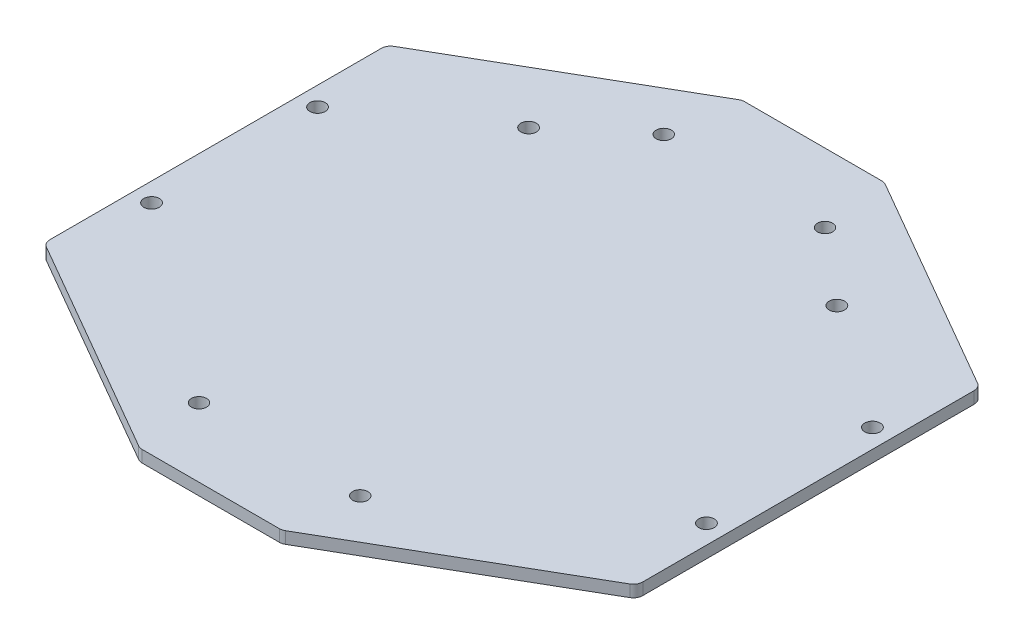
ISO-10303-21;
HEADER;
FILE_DESCRIPTION(('STEP AP214'),'2;1');
FILE_NAME('part.step','',(''),(''),'','','');
FILE_SCHEMA(('AUTOMOTIVE_DESIGN { 1 0 10303 214 1 1 1 1 }'));
ENDSEC;
DATA;
#1=APPLICATION_CONTEXT('core data for automotive mechanical design processes');
#2=APPLICATION_PROTOCOL_DEFINITION('international standard','automotive_design',2000,#1);
#3=PRODUCT_CONTEXT('',#1,'mechanical');
#4=PRODUCT('Part','Part','',(#3));
#5=PRODUCT_RELATED_PRODUCT_CATEGORY('part','',(#4));
#6=PRODUCT_DEFINITION_FORMATION('','',#4);
#7=PRODUCT_DEFINITION_CONTEXT('part definition',#1,'design');
#8=PRODUCT_DEFINITION('design','',#6,#7);
#9=PRODUCT_DEFINITION_SHAPE('','',#8);
#10=(LENGTH_UNIT() NAMED_UNIT(*) SI_UNIT(.MILLI.,.METRE.));
#11=(NAMED_UNIT(*) PLANE_ANGLE_UNIT() SI_UNIT($,.RADIAN.));
#12=(NAMED_UNIT(*) SI_UNIT($,.STERADIAN.) SOLID_ANGLE_UNIT());
#13=UNCERTAINTY_MEASURE_WITH_UNIT(LENGTH_MEASURE(1.E-05),#10,'distance_accuracy_value','');
#14=(GEOMETRIC_REPRESENTATION_CONTEXT(3) GLOBAL_UNCERTAINTY_ASSIGNED_CONTEXT((#13)) GLOBAL_UNIT_ASSIGNED_CONTEXT((#10,
#11,#12)) REPRESENTATION_CONTEXT('',''));
#15=CARTESIAN_POINT('',(0.,0.,0.));
#16=DIRECTION('',(0.,0.,1.));
#17=DIRECTION('',(1.,0.,0.));
#18=AXIS2_PLACEMENT_3D('',#15,#16,#17);
#19=CARTESIAN_POINT('',(-15.,2.5,-63.5085296108589));
#20=DIRECTION('',(0.5,0.,0.866025403784439));
#21=DIRECTION('',(0.866025403784439,0.,-0.5));
#22=AXIS2_PLACEMENT_3D('',#19,#20,#21);
#23=PLANE('',#22);
#24=DIRECTION('',(-0.866025403784439,0.,0.5));
#25=VECTOR('',#24,1.);
#26=CARTESIAN_POINT('',(-15.,2.5,-63.5085296108589));
#27=LINE('',#26,#25);
#28=CARTESIAN_POINT('',(-15.4641016151377,2.5,-63.2405804184277));
#29=VERTEX_POINT('',#28);
#30=CARTESIAN_POINT('',(-61.5,2.5,-36.6617420935413));
#31=VERTEX_POINT('',#30);
#32=EDGE_CURVE('E177',#29,#31,#27,.T.);
#33=ORIENTED_EDGE('',*,*,#32,.F.);
#34=DIRECTION('',(0.,-1.,0.));
#35=VECTOR('',#34,1.);
#36=CARTESIAN_POINT('',(-15.4641016151377,2.5,-63.2405804184277));
#37=LINE('',#36,#35);
#38=CARTESIAN_POINT('',(-15.4641016151377,0.,-63.2405804184277));
#39=VERTEX_POINT('',#38);
#40=EDGE_CURVE('E228',#29,#39,#37,.T.);
#41=ORIENTED_EDGE('',*,*,#40,.T.);
#42=DIRECTION('',(-0.866025403784439,0.,0.5));
#43=VECTOR('',#42,1.);
#44=CARTESIAN_POINT('',(-15.,0.,-63.5085296108589));
#45=LINE('',#44,#43);
#46=CARTESIAN_POINT('',(-61.5,0.,-36.6617420935413));
#47=VERTEX_POINT('',#46);
#48=EDGE_CURVE('E274',#39,#47,#45,.T.);
#49=ORIENTED_EDGE('',*,*,#48,.T.);
#50=DIRECTION('',(0.,-1.,0.));
#51=VECTOR('',#50,1.);
#52=CARTESIAN_POINT('',(-61.5,2.5,-36.6617420935413));
#53=LINE('',#52,#51);
#54=EDGE_CURVE('E226',#47,#31,#53,.F.);
#55=ORIENTED_EDGE('',*,*,#54,.T.);
#56=EDGE_LOOP('',(#33,#41,#49,#55));
#57=FACE_BOUND('',#56,.T.);
#58=ADVANCED_FACE('F37',(#57),#23,.F.);
#59=CARTESIAN_POINT('',(-62.5,2.5,-36.0843918243516));
#60=DIRECTION('',(1.,0.,0.));
#61=DIRECTION('',(0.,0.,-1.));
#62=AXIS2_PLACEMENT_3D('',#59,#60,#61);
#63=PLANE('',#62);
#64=DIRECTION('',(0.,0.,1.));
#65=VECTOR('',#64,1.);
#66=CARTESIAN_POINT('',(-62.5,2.5,-36.0843918243516));
#67=LINE('',#66,#65);
#68=CARTESIAN_POINT('',(-62.5,2.5,-34.9296912859724));
#69=VERTEX_POINT('',#68);
#70=CARTESIAN_POINT('',(-62.5,2.5,34.9296912859724));
#71=VERTEX_POINT('',#70);
#72=EDGE_CURVE('E181',#69,#71,#67,.T.);
#73=ORIENTED_EDGE('',*,*,#72,.F.);
#74=DIRECTION('',(0.,-1.,0.));
#75=VECTOR('',#74,1.);
#76=CARTESIAN_POINT('',(-62.5,2.5,-34.9296912859724));
#77=LINE('',#76,#75);
#78=CARTESIAN_POINT('',(-62.5,0.,-34.9296912859724));
#79=VERTEX_POINT('',#78);
#80=EDGE_CURVE('E233',#69,#79,#77,.T.);
#81=ORIENTED_EDGE('',*,*,#80,.T.);
#82=DIRECTION('',(0.,0.,1.));
#83=VECTOR('',#82,1.);
#84=CARTESIAN_POINT('',(-62.5,0.,-36.0843918243516));
#85=LINE('',#84,#83);
#86=CARTESIAN_POINT('',(-62.5,0.,34.9296912859724));
#87=VERTEX_POINT('',#86);
#88=EDGE_CURVE('E271',#79,#87,#85,.T.);
#89=ORIENTED_EDGE('',*,*,#88,.T.);
#90=DIRECTION('',(0.,-1.,0.));
#91=VECTOR('',#90,1.);
#92=CARTESIAN_POINT('',(-62.5,2.5,34.9296912859724));
#93=LINE('',#92,#91);
#94=EDGE_CURVE('E231',#87,#71,#93,.F.);
#95=ORIENTED_EDGE('',*,*,#94,.T.);
#96=EDGE_LOOP('',(#73,#81,#89,#95));
#97=FACE_BOUND('',#96,.T.);
#98=ADVANCED_FACE('F364',(#97),#63,.F.);
#99=CARTESIAN_POINT('',(-62.5,2.5,36.0843918243516));
#100=DIRECTION('',(0.5,0.,-0.866025403784439));
#101=DIRECTION('',(-0.866025403784439,0.,-0.5));
#102=AXIS2_PLACEMENT_3D('',#99,#100,#101);
#103=PLANE('',#102);
#104=DIRECTION('',(0.866025403784439,0.,0.5));
#105=VECTOR('',#104,1.);
#106=CARTESIAN_POINT('',(-62.5,2.5,36.0843918243516));
#107=LINE('',#106,#105);
#108=CARTESIAN_POINT('',(-61.5,2.5,36.6617420935412));
#109=VERTEX_POINT('',#108);
#110=CARTESIAN_POINT('',(-15.4641016151378,2.5,63.2405804184277));
#111=VERTEX_POINT('',#110);
#112=EDGE_CURVE('E288',#109,#111,#107,.T.);
#113=ORIENTED_EDGE('',*,*,#112,.F.);
#114=DIRECTION('',(0.,-1.,0.));
#115=VECTOR('',#114,1.);
#116=CARTESIAN_POINT('',(-61.5,2.5,36.6617420935412));
#117=LINE('',#116,#115);
#118=CARTESIAN_POINT('',(-61.5,0.,36.6617420935412));
#119=VERTEX_POINT('',#118);
#120=EDGE_CURVE('E238',#109,#119,#117,.T.);
#121=ORIENTED_EDGE('',*,*,#120,.T.);
#122=DIRECTION('',(0.866025403784439,0.,0.5));
#123=VECTOR('',#122,1.);
#124=CARTESIAN_POINT('',(-62.5,0.,36.0843918243516));
#125=LINE('',#124,#123);
#126=CARTESIAN_POINT('',(-15.4641016151378,0.,63.2405804184277));
#127=VERTEX_POINT('',#126);
#128=EDGE_CURVE('E266',#119,#127,#125,.T.);
#129=ORIENTED_EDGE('',*,*,#128,.T.);
#130=DIRECTION('',(0.,-1.,0.));
#131=VECTOR('',#130,1.);
#132=CARTESIAN_POINT('',(-15.4641016151378,2.5,63.2405804184277));
#133=LINE('',#132,#131);
#134=EDGE_CURVE('E236',#127,#111,#133,.F.);
#135=ORIENTED_EDGE('',*,*,#134,.T.);
#136=EDGE_LOOP('',(#113,#121,#129,#135));
#137=FACE_BOUND('',#136,.T.);
#138=ADVANCED_FACE('F370',(#137),#103,.F.);
#139=CARTESIAN_POINT('',(-15.,2.5,63.5085296108588));
#140=DIRECTION('',(0.,0.,-1.));
#141=DIRECTION('',(-1.,0.,0.));
#142=AXIS2_PLACEMENT_3D('',#139,#140,#141);
#143=PLANE('',#142);
#144=DIRECTION('',(1.,0.,0.));
#145=VECTOR('',#144,1.);
#146=CARTESIAN_POINT('',(-15.,2.5,63.5085296108588));
#147=LINE('',#146,#145);
#148=CARTESIAN_POINT('',(-14.4641016151378,2.5,63.5085296108588));
#149=VERTEX_POINT('',#148);
#150=CARTESIAN_POINT('',(14.4641016151377,2.5,63.5085296108588));
#151=VERTEX_POINT('',#150);
#152=EDGE_CURVE('E285',#149,#151,#147,.T.);
#153=ORIENTED_EDGE('',*,*,#152,.F.);
#154=DIRECTION('',(0.,-1.,0.));
#155=VECTOR('',#154,1.);
#156=CARTESIAN_POINT('',(-14.4641016151378,2.5,63.5085296108588));
#157=LINE('',#156,#155);
#158=CARTESIAN_POINT('',(-14.4641016151378,0.,63.5085296108588));
#159=VERTEX_POINT('',#158);
#160=EDGE_CURVE('E243',#149,#159,#157,.T.);
#161=ORIENTED_EDGE('',*,*,#160,.T.);
#162=DIRECTION('',(1.,0.,0.));
#163=VECTOR('',#162,1.);
#164=CARTESIAN_POINT('',(-15.,0.,63.5085296108588));
#165=LINE('',#164,#163);
#166=CARTESIAN_POINT('',(14.4641016151377,0.,63.5085296108588));
#167=VERTEX_POINT('',#166);
#168=EDGE_CURVE('E264',#159,#167,#165,.T.);
#169=ORIENTED_EDGE('',*,*,#168,.T.);
#170=DIRECTION('',(0.,-1.,0.));
#171=VECTOR('',#170,1.);
#172=CARTESIAN_POINT('',(14.4641016151377,2.5,63.5085296108588));
#173=LINE('',#172,#171);
#174=EDGE_CURVE('E241',#167,#151,#173,.F.);
#175=ORIENTED_EDGE('',*,*,#174,.T.);
#176=EDGE_LOOP('',(#153,#161,#169,#175));
#177=FACE_BOUND('',#176,.T.);
#178=ADVANCED_FACE('F429',(#177),#143,.F.);
#179=CARTESIAN_POINT('',(15.,2.5,63.5085296108588));
#180=DIRECTION('',(-0.5,0.,-0.866025403784439));
#181=DIRECTION('',(-0.866025403784439,0.,0.5));
#182=AXIS2_PLACEMENT_3D('',#179,#180,#181);
#183=PLANE('',#182);
#184=DIRECTION('',(0.866025403784439,0.,-0.5));
#185=VECTOR('',#184,1.);
#186=CARTESIAN_POINT('',(15.,2.5,63.5085296108588));
#187=LINE('',#186,#185);
#188=CARTESIAN_POINT('',(15.4641016151377,2.5,63.2405804184277));
#189=VERTEX_POINT('',#188);
#190=CARTESIAN_POINT('',(61.5,2.5,36.6617420935412));
#191=VERTEX_POINT('',#190);
#192=EDGE_CURVE('E258',#189,#191,#187,.T.);
#193=ORIENTED_EDGE('',*,*,#192,.F.);
#194=DIRECTION('',(0.,-1.,0.));
#195=VECTOR('',#194,1.);
#196=CARTESIAN_POINT('',(15.4641016151377,2.5,63.2405804184277));
#197=LINE('',#196,#195);
#198=CARTESIAN_POINT('',(15.4641016151377,0.,63.2405804184277));
#199=VERTEX_POINT('',#198);
#200=EDGE_CURVE('E248',#189,#199,#197,.T.);
#201=ORIENTED_EDGE('',*,*,#200,.T.);
#202=DIRECTION('',(0.866025403784439,0.,-0.5));
#203=VECTOR('',#202,1.);
#204=CARTESIAN_POINT('',(15.,0.,63.5085296108588));
#205=LINE('',#204,#203);
#206=CARTESIAN_POINT('',(61.5,0.,36.6617420935412));
#207=VERTEX_POINT('',#206);
#208=EDGE_CURVE('E256',#199,#207,#205,.T.);
#209=ORIENTED_EDGE('',*,*,#208,.T.);
#210=DIRECTION('',(0.,-1.,0.));
#211=VECTOR('',#210,1.);
#212=CARTESIAN_POINT('',(61.5,2.5,36.6617420935412));
#213=LINE('',#212,#211);
#214=EDGE_CURVE('E246',#207,#191,#213,.F.);
#215=ORIENTED_EDGE('',*,*,#214,.T.);
#216=EDGE_LOOP('',(#193,#201,#209,#215));
#217=FACE_BOUND('',#216,.T.);
#218=ADVANCED_FACE('F255',(#217),#183,.F.);
#219=CARTESIAN_POINT('',(62.5,2.5,36.0843918243516));
#220=DIRECTION('',(-1.,0.,0.));
#221=DIRECTION('',(0.,0.,1.));
#222=AXIS2_PLACEMENT_3D('',#219,#220,#221);
#223=PLANE('',#222);
#224=DIRECTION('',(0.,0.,-1.));
#225=VECTOR('',#224,1.);
#226=CARTESIAN_POINT('',(62.5,2.5,36.0843918243516));
#227=LINE('',#226,#225);
#228=CARTESIAN_POINT('',(62.5,2.5,34.9296912859724));
#229=VERTEX_POINT('',#228);
#230=CARTESIAN_POINT('',(62.5,2.5,-34.9296912859724));
#231=VERTEX_POINT('',#230);
#232=EDGE_CURVE('E282',#229,#231,#227,.T.);
#233=ORIENTED_EDGE('',*,*,#232,.F.);
#234=DIRECTION('',(0.,-1.,0.));
#235=VECTOR('',#234,1.);
#236=CARTESIAN_POINT('',(62.5,2.5,34.9296912859724));
#237=LINE('',#236,#235);
#238=CARTESIAN_POINT('',(62.5,0.,34.9296912859724));
#239=VERTEX_POINT('',#238);
#240=EDGE_CURVE('E11',#229,#239,#237,.T.);
#241=ORIENTED_EDGE('',*,*,#240,.T.);
#242=DIRECTION('',(0.,0.,-1.));
#243=VECTOR('',#242,1.);
#244=CARTESIAN_POINT('',(62.5,0.,36.0843918243516));
#245=LINE('',#244,#243);
#246=CARTESIAN_POINT('',(62.5,0.,-34.9296912859724));
#247=VERTEX_POINT('',#246);
#248=EDGE_CURVE('E183',#239,#247,#245,.T.);
#249=ORIENTED_EDGE('',*,*,#248,.T.);
#250=DIRECTION('',(0.,-1.,0.));
#251=VECTOR('',#250,1.);
#252=CARTESIAN_POINT('',(62.5,2.5,-34.9296912859724));
#253=LINE('',#252,#251);
#254=EDGE_CURVE('E45',#247,#231,#253,.F.);
#255=ORIENTED_EDGE('',*,*,#254,.T.);
#256=EDGE_LOOP('',(#233,#241,#249,#255));
#257=FACE_BOUND('',#256,.T.);
#258=ADVANCED_FACE('F404',(#257),#223,.F.);
#259=CARTESIAN_POINT('',(62.5,2.5,-36.0843918243516));
#260=DIRECTION('',(-0.5,0.,0.866025403784439));
#261=DIRECTION('',(0.866025403784439,0.,0.5));
#262=AXIS2_PLACEMENT_3D('',#259,#260,#261);
#263=PLANE('',#262);
#264=DIRECTION('',(-0.866025403784438,0.,-0.5));
#265=VECTOR('',#264,1.);
#266=CARTESIAN_POINT('',(62.5,0.,-36.0843918243516));
#267=LINE('',#266,#265);
#268=CARTESIAN_POINT('',(61.5,0.,-36.6617420935413));
#269=VERTEX_POINT('',#268);
#270=CARTESIAN_POINT('',(15.4641016151378,0.,-63.2405804184277));
#271=VERTEX_POINT('',#270);
#272=EDGE_CURVE('E178',#269,#271,#267,.T.);
#273=ORIENTED_EDGE('',*,*,#272,.T.);
#274=DIRECTION('',(0.,-1.,0.));
#275=VECTOR('',#274,1.);
#276=CARTESIAN_POINT('',(15.4641016151378,2.5,-63.2405804184278));
#277=LINE('',#276,#275);
#278=CARTESIAN_POINT('',(15.4641016151378,2.5,-63.2405804184277));
#279=VERTEX_POINT('',#278);
#280=EDGE_CURVE('E156',#271,#279,#277,.F.);
#281=ORIENTED_EDGE('',*,*,#280,.T.);
#282=DIRECTION('',(-0.866025403784438,0.,-0.5));
#283=VECTOR('',#282,1.);
#284=CARTESIAN_POINT('',(62.5,2.5,-36.0843918243516));
#285=LINE('',#284,#283);
#286=CARTESIAN_POINT('',(61.5,2.5,-36.6617420935413));
#287=VERTEX_POINT('',#286);
#288=EDGE_CURVE('E279',#287,#279,#285,.T.);
#289=ORIENTED_EDGE('',*,*,#288,.F.);
#290=DIRECTION('',(0.,-1.,0.));
#291=VECTOR('',#290,1.);
#292=CARTESIAN_POINT('',(61.5,2.5,-36.6617420935413));
#293=LINE('',#292,#291);
#294=EDGE_CURVE('E161',#287,#269,#293,.T.);
#295=ORIENTED_EDGE('',*,*,#294,.T.);
#296=EDGE_LOOP('',(#273,#281,#289,#295));
#297=FACE_BOUND('',#296,.T.);
#298=ADVANCED_FACE('F409',(#297),#263,.F.);
#299=CARTESIAN_POINT('',(-15.,2.5,-63.5085296108589));
#300=DIRECTION('',(0.,0.,1.));
#301=DIRECTION('',(1.,0.,0.));
#302=AXIS2_PLACEMENT_3D('',#299,#300,#301);
#303=PLANE('',#302);
#304=DIRECTION('',(-1.,0.,0.));
#305=VECTOR('',#304,1.);
#306=CARTESIAN_POINT('',(-15.,2.5,-63.5085296108589));
#307=LINE('',#306,#305);
#308=CARTESIAN_POINT('',(14.4641016151378,2.5,-63.5085296108589));
#309=VERTEX_POINT('',#308);
#310=CARTESIAN_POINT('',(-14.4641016151377,2.5,-63.5085296108589));
#311=VERTEX_POINT('',#310);
#312=EDGE_CURVE('E171',#309,#311,#307,.T.);
#313=ORIENTED_EDGE('',*,*,#312,.F.);
#314=DIRECTION('',(0.,-1.,0.));
#315=VECTOR('',#314,1.);
#316=CARTESIAN_POINT('',(14.4641016151378,2.5,-63.5085296108589));
#317=LINE('',#316,#315);
#318=CARTESIAN_POINT('',(14.4641016151378,0.,-63.5085296108589));
#319=VERTEX_POINT('',#318);
#320=EDGE_CURVE('E155',#309,#319,#317,.T.);
#321=ORIENTED_EDGE('',*,*,#320,.T.);
#322=DIRECTION('',(-1.,0.,0.));
#323=VECTOR('',#322,1.);
#324=CARTESIAN_POINT('',(-15.,0.,-63.5085296108589));
#325=LINE('',#324,#323);
#326=CARTESIAN_POINT('',(-14.4641016151377,0.,-63.5085296108589));
#327=VERTEX_POINT('',#326);
#328=EDGE_CURVE('E168',#319,#327,#325,.T.);
#329=ORIENTED_EDGE('',*,*,#328,.T.);
#330=DIRECTION('',(0.,-1.,0.));
#331=VECTOR('',#330,1.);
#332=CARTESIAN_POINT('',(-14.4641016151377,2.5,-63.5085296108589));
#333=LINE('',#332,#331);
#334=EDGE_CURVE('E173',#327,#311,#333,.F.);
#335=ORIENTED_EDGE('',*,*,#334,.T.);
#336=EDGE_LOOP('',(#313,#321,#329,#335));
#337=FACE_BOUND('',#336,.T.);
#338=ADVANCED_FACE('F167',(#337),#303,.F.);
#339=CARTESIAN_POINT('',(0.,2.5,0.));
#340=DIRECTION('',(0.,1.,0.));
#341=DIRECTION('',(0.,0.,1.));
#342=AXIS2_PLACEMENT_3D('',#339,#340,#341);
#343=PLANE('',#342);
#344=CARTESIAN_POINT('',(58.5,2.5,-17.4999999999999));
#345=DIRECTION('',(0.,1.,0.));
#346=DIRECTION('',(0.,0.,1.));
#347=AXIS2_PLACEMENT_3D('',#344,#345,#346);
#348=CIRCLE('',#347,1.625);
#349=CARTESIAN_POINT('',(58.5,2.5,-15.8749999999999));
#350=VERTEX_POINT('',#349);
#351=EDGE_CURVE('E318',#350,#350,#348,.T.);
#352=ORIENTED_EDGE('',*,*,#351,.F.);
#353=EDGE_LOOP('',(#352));
#354=FACE_BOUND('',#353,.T.);
#355=CARTESIAN_POINT('',(58.5,2.5,17.5000000000001));
#356=DIRECTION('',(0.,1.,0.));
#357=DIRECTION('',(0.,0.,1.));
#358=AXIS2_PLACEMENT_3D('',#355,#356,#357);
#359=CIRCLE('',#358,1.625);
#360=CARTESIAN_POINT('',(58.5,2.5,19.1250000000001));
#361=VERTEX_POINT('',#360);
#362=EDGE_CURVE('E323',#361,#361,#359,.T.);
#363=ORIENTED_EDGE('',*,*,#362,.F.);
#364=EDGE_LOOP('',(#363));
#365=FACE_BOUND('',#364,.T.);
#366=CARTESIAN_POINT('',(-58.5,2.5,17.5));
#367=DIRECTION('',(0.,1.,0.));
#368=DIRECTION('',(0.,0.,1.));
#369=AXIS2_PLACEMENT_3D('',#366,#367,#368);
#370=CIRCLE('',#369,1.625);
#371=CARTESIAN_POINT('',(-58.5,2.5,19.125));
#372=VERTEX_POINT('',#371);
#373=EDGE_CURVE('E326',#372,#372,#370,.T.);
#374=ORIENTED_EDGE('',*,*,#373,.F.);
#375=EDGE_LOOP('',(#374));
#376=FACE_BOUND('',#375,.T.);
#377=CARTESIAN_POINT('',(-58.5,2.5,-17.5));
#378=DIRECTION('',(0.,1.,0.));
#379=DIRECTION('',(0.,0.,1.));
#380=AXIS2_PLACEMENT_3D('',#377,#378,#379);
#381=CIRCLE('',#380,1.625);
#382=CARTESIAN_POINT('',(-58.5,2.5,-15.875));
#383=VERTEX_POINT('',#382);
#384=EDGE_CURVE('E329',#383,#383,#381,.T.);
#385=ORIENTED_EDGE('',*,*,#384,.F.);
#386=EDGE_LOOP('',(#385));
#387=FACE_BOUND('',#386,.T.);
#388=CARTESIAN_POINT('',(-32.5,2.5,-36.));
#389=DIRECTION('',(0.,1.,0.));
#390=DIRECTION('',(0.,0.,1.));
#391=AXIS2_PLACEMENT_3D('',#388,#389,#390);
#392=CIRCLE('',#391,1.625);
#393=CARTESIAN_POINT('',(-32.5,2.5,-34.375));
#394=VERTEX_POINT('',#393);
#395=EDGE_CURVE('E191',#394,#394,#392,.T.);
#396=ORIENTED_EDGE('',*,*,#395,.F.);
#397=EDGE_LOOP('',(#396));
#398=FACE_BOUND('',#397,.T.);
#399=CARTESIAN_POINT('',(32.5,2.5,-36.));
#400=DIRECTION('',(0.,1.,0.));
#401=DIRECTION('',(0.,0.,1.));
#402=AXIS2_PLACEMENT_3D('',#399,#400,#401);
#403=CIRCLE('',#402,1.625);
#404=CARTESIAN_POINT('',(32.5,2.5,-34.375));
#405=VERTEX_POINT('',#404);
#406=EDGE_CURVE('E315',#405,#405,#403,.T.);
#407=ORIENTED_EDGE('',*,*,#406,.F.);
#408=EDGE_LOOP('',(#407));
#409=FACE_BOUND('',#408,.T.);
#410=CARTESIAN_POINT('',(-17.,2.5,49.));
#411=DIRECTION('',(0.,1.,0.));
#412=DIRECTION('',(0.,0.,1.));
#413=AXIS2_PLACEMENT_3D('',#410,#411,#412);
#414=CIRCLE('',#413,1.6);
#415=CARTESIAN_POINT('',(-17.,2.5,50.6));
#416=VERTEX_POINT('',#415);
#417=EDGE_CURVE('E277',#416,#416,#414,.T.);
#418=ORIENTED_EDGE('',*,*,#417,.F.);
#419=EDGE_LOOP('',(#418));
#420=FACE_BOUND('',#419,.T.);
#421=CARTESIAN_POINT('',(17.,2.5,-49.));
#422=DIRECTION('',(0.,1.,0.));
#423=DIRECTION('',(0.,0.,1.));
#424=AXIS2_PLACEMENT_3D('',#421,#422,#423);
#425=CIRCLE('',#424,1.6);
#426=CARTESIAN_POINT('',(17.,2.5,-47.4));
#427=VERTEX_POINT('',#426);
#428=EDGE_CURVE('E295',#427,#427,#425,.T.);
#429=ORIENTED_EDGE('',*,*,#428,.F.);
#430=EDGE_LOOP('',(#429));
#431=FACE_BOUND('',#430,.T.);
#432=CARTESIAN_POINT('',(-17.,2.5,-49.));
#433=DIRECTION('',(0.,1.,0.));
#434=DIRECTION('',(0.,0.,1.));
#435=AXIS2_PLACEMENT_3D('',#432,#433,#434);
#436=CIRCLE('',#435,1.6);
#437=CARTESIAN_POINT('',(-17.,2.5,-47.4));
#438=VERTEX_POINT('',#437);
#439=EDGE_CURVE('E298',#438,#438,#436,.T.);
#440=ORIENTED_EDGE('',*,*,#439,.F.);
#441=EDGE_LOOP('',(#440));
#442=FACE_BOUND('',#441,.T.);
#443=CARTESIAN_POINT('',(17.,2.5,49.));
#444=DIRECTION('',(0.,1.,0.));
#445=DIRECTION('',(0.,0.,1.));
#446=AXIS2_PLACEMENT_3D('',#443,#444,#445);
#447=CIRCLE('',#446,1.6);
#448=CARTESIAN_POINT('',(17.,2.5,50.6));
#449=VERTEX_POINT('',#448);
#450=EDGE_CURVE('E301',#449,#449,#447,.T.);
#451=ORIENTED_EDGE('',*,*,#450,.F.);
#452=EDGE_LOOP('',(#451));
#453=FACE_BOUND('',#452,.T.);
#454=ORIENTED_EDGE('',*,*,#288,.T.);
#455=CARTESIAN_POINT('',(14.4641016151378,2.5,-61.5085296108589));
#456=DIRECTION('',(0.,1.,0.));
#457=DIRECTION('',(0.,0.,1.));
#458=AXIS2_PLACEMENT_3D('',#455,#456,#457);
#459=CIRCLE('',#458,2.);
#460=EDGE_CURVE('E224',#279,#309,#459,.T.);
#461=ORIENTED_EDGE('',*,*,#460,.T.);
#462=ORIENTED_EDGE('',*,*,#312,.T.);
#463=CARTESIAN_POINT('',(-14.4641016151377,2.5,-61.5085296108589));
#464=DIRECTION('',(0.,1.,0.));
#465=DIRECTION('',(0.,0.,1.));
#466=AXIS2_PLACEMENT_3D('',#463,#464,#465);
#467=CIRCLE('',#466,2.);
#468=EDGE_CURVE('E222',#311,#29,#467,.T.);
#469=ORIENTED_EDGE('',*,*,#468,.T.);
#470=ORIENTED_EDGE('',*,*,#32,.T.);
#471=CARTESIAN_POINT('',(-60.5,2.5,-34.9296912859724));
#472=DIRECTION('',(0.,1.,0.));
#473=DIRECTION('',(0.,0.,1.));
#474=AXIS2_PLACEMENT_3D('',#471,#472,#473);
#475=CIRCLE('',#474,2.);
#476=EDGE_CURVE('E220',#31,#69,#475,.T.);
#477=ORIENTED_EDGE('',*,*,#476,.T.);
#478=ORIENTED_EDGE('',*,*,#72,.T.);
#479=CARTESIAN_POINT('',(-60.5,2.5,34.9296912859724));
#480=DIRECTION('',(0.,1.,0.));
#481=DIRECTION('',(0.,0.,1.));
#482=AXIS2_PLACEMENT_3D('',#479,#480,#481);
#483=CIRCLE('',#482,2.);
#484=EDGE_CURVE('E218',#71,#109,#483,.T.);
#485=ORIENTED_EDGE('',*,*,#484,.T.);
#486=ORIENTED_EDGE('',*,*,#112,.T.);
#487=CARTESIAN_POINT('',(-14.4641016151378,2.5,61.5085296108588));
#488=DIRECTION('',(0.,1.,0.));
#489=DIRECTION('',(0.,0.,1.));
#490=AXIS2_PLACEMENT_3D('',#487,#488,#489);
#491=CIRCLE('',#490,2.);
#492=EDGE_CURVE('E216',#111,#149,#491,.T.);
#493=ORIENTED_EDGE('',*,*,#492,.T.);
#494=ORIENTED_EDGE('',*,*,#152,.T.);
#495=CARTESIAN_POINT('',(14.4641016151377,2.5,61.5085296108588));
#496=DIRECTION('',(0.,1.,0.));
#497=DIRECTION('',(0.,0.,1.));
#498=AXIS2_PLACEMENT_3D('',#495,#496,#497);
#499=CIRCLE('',#498,2.);
#500=EDGE_CURVE('E214',#151,#189,#499,.T.);
#501=ORIENTED_EDGE('',*,*,#500,.T.);
#502=ORIENTED_EDGE('',*,*,#192,.T.);
#503=CARTESIAN_POINT('',(60.5,2.5,34.9296912859724));
#504=DIRECTION('',(0.,1.,0.));
#505=DIRECTION('',(0.,0.,1.));
#506=AXIS2_PLACEMENT_3D('',#503,#504,#505);
#507=CIRCLE('',#506,2.);
#508=EDGE_CURVE('E58',#191,#229,#507,.T.);
#509=ORIENTED_EDGE('',*,*,#508,.T.);
#510=ORIENTED_EDGE('',*,*,#232,.T.);
#511=CARTESIAN_POINT('',(60.5,2.5,-34.9296912859724));
#512=DIRECTION('',(0.,1.,0.));
#513=DIRECTION('',(0.,0.,1.));
#514=AXIS2_PLACEMENT_3D('',#511,#512,#513);
#515=CIRCLE('',#514,2.);
#516=EDGE_CURVE('E211',#231,#287,#515,.T.);
#517=ORIENTED_EDGE('',*,*,#516,.T.);
#518=EDGE_LOOP('',(#454,#461,#462,#469,#470,#477,#478,#485,#486,#493,#494,#501,#502,#509,#510,#517));
#519=FACE_BOUND('',#518,.T.);
#520=ADVANCED_FACE('F410',(#354,#365,#376,#387,#398,#409,#420,#431,#442,#453,#519),#343,.T.);
#521=CARTESIAN_POINT('',(0.,0.,0.));
#522=DIRECTION('',(0.,1.,0.));
#523=DIRECTION('',(0.,0.,1.));
#524=AXIS2_PLACEMENT_3D('',#521,#522,#523);
#525=PLANE('',#524);
#526=CARTESIAN_POINT('',(58.5,0.,-17.4999999999999));
#527=DIRECTION('',(0.,1.,0.));
#528=DIRECTION('',(0.,0.,-1.));
#529=AXIS2_PLACEMENT_3D('',#526,#527,#528);
#530=CIRCLE('',#529,1.625);
#531=CARTESIAN_POINT('',(58.5,0.,-19.1249999999999));
#532=VERTEX_POINT('',#531);
#533=EDGE_CURVE('E336',#532,#532,#530,.T.);
#534=ORIENTED_EDGE('',*,*,#533,.T.);
#535=EDGE_LOOP('',(#534));
#536=FACE_BOUND('',#535,.T.);
#537=CARTESIAN_POINT('',(58.5,0.,17.5000000000001));
#538=DIRECTION('',(0.,1.,0.));
#539=DIRECTION('',(0.,0.,-1.));
#540=AXIS2_PLACEMENT_3D('',#537,#538,#539);
#541=CIRCLE('',#540,1.625);
#542=CARTESIAN_POINT('',(58.5,0.,15.8750000000001));
#543=VERTEX_POINT('',#542);
#544=EDGE_CURVE('E339',#543,#543,#541,.T.);
#545=ORIENTED_EDGE('',*,*,#544,.T.);
#546=EDGE_LOOP('',(#545));
#547=FACE_BOUND('',#546,.T.);
#548=CARTESIAN_POINT('',(-58.5,0.,17.5));
#549=DIRECTION('',(0.,1.,0.));
#550=DIRECTION('',(0.,0.,1.));
#551=AXIS2_PLACEMENT_3D('',#548,#549,#550);
#552=CIRCLE('',#551,1.625);
#553=CARTESIAN_POINT('',(-58.5,0.,19.125));
#554=VERTEX_POINT('',#553);
#555=EDGE_CURVE('E335',#554,#554,#552,.T.);
#556=ORIENTED_EDGE('',*,*,#555,.T.);
#557=EDGE_LOOP('',(#556));
#558=FACE_BOUND('',#557,.T.);
#559=CARTESIAN_POINT('',(-58.5,0.,-17.5));
#560=DIRECTION('',(0.,1.,0.));
#561=DIRECTION('',(0.,0.,1.));
#562=AXIS2_PLACEMENT_3D('',#559,#560,#561);
#563=CIRCLE('',#562,1.625);
#564=CARTESIAN_POINT('',(-58.5,0.,-15.875));
#565=VERTEX_POINT('',#564);
#566=EDGE_CURVE('E332',#565,#565,#563,.T.);
#567=ORIENTED_EDGE('',*,*,#566,.T.);
#568=EDGE_LOOP('',(#567));
#569=FACE_BOUND('',#568,.T.);
#570=CARTESIAN_POINT('',(-32.5,0.,-36.));
#571=DIRECTION('',(0.,1.,0.));
#572=DIRECTION('',(0.,0.,1.));
#573=AXIS2_PLACEMENT_3D('',#570,#571,#572);
#574=CIRCLE('',#573,1.625);
#575=CARTESIAN_POINT('',(-32.5,0.,-34.375));
#576=VERTEX_POINT('',#575);
#577=EDGE_CURVE('E190',#576,#576,#574,.T.);
#578=ORIENTED_EDGE('',*,*,#577,.T.);
#579=EDGE_LOOP('',(#578));
#580=FACE_BOUND('',#579,.T.);
#581=CARTESIAN_POINT('',(32.5,0.,-36.));
#582=DIRECTION('',(0.,1.,0.));
#583=DIRECTION('',(0.,0.,1.));
#584=AXIS2_PLACEMENT_3D('',#581,#582,#583);
#585=CIRCLE('',#584,1.625);
#586=CARTESIAN_POINT('',(32.5,0.,-34.375));
#587=VERTEX_POINT('',#586);
#588=EDGE_CURVE('E187',#587,#587,#585,.T.);
#589=ORIENTED_EDGE('',*,*,#588,.T.);
#590=EDGE_LOOP('',(#589));
#591=FACE_BOUND('',#590,.T.);
#592=CARTESIAN_POINT('',(-17.,0.,49.));
#593=DIRECTION('',(0.,-1.,0.));
#594=DIRECTION('',(0.,0.,-1.));
#595=AXIS2_PLACEMENT_3D('',#592,#593,#594);
#596=CIRCLE('',#595,1.6);
#597=CARTESIAN_POINT('',(-17.,0.,47.4));
#598=VERTEX_POINT('',#597);
#599=EDGE_CURVE('E307',#598,#598,#596,.T.);
#600=ORIENTED_EDGE('',*,*,#599,.F.);
#601=EDGE_LOOP('',(#600));
#602=FACE_BOUND('',#601,.T.);
#603=CARTESIAN_POINT('',(17.,0.,-49.));
#604=DIRECTION('',(0.,-1.,0.));
#605=DIRECTION('',(0.,0.,1.));
#606=AXIS2_PLACEMENT_3D('',#603,#604,#605);
#607=CIRCLE('',#606,1.6);
#608=CARTESIAN_POINT('',(17.,0.,-47.4));
#609=VERTEX_POINT('',#608);
#610=EDGE_CURVE('E308',#609,#609,#607,.T.);
#611=ORIENTED_EDGE('',*,*,#610,.F.);
#612=EDGE_LOOP('',(#611));
#613=FACE_BOUND('',#612,.T.);
#614=CARTESIAN_POINT('',(-17.,0.,-49.));
#615=DIRECTION('',(0.,-1.,0.));
#616=DIRECTION('',(0.,0.,1.));
#617=AXIS2_PLACEMENT_3D('',#614,#615,#616);
#618=CIRCLE('',#617,1.6);
#619=CARTESIAN_POINT('',(-17.,0.,-47.4));
#620=VERTEX_POINT('',#619);
#621=EDGE_CURVE('E194',#620,#620,#618,.T.);
#622=ORIENTED_EDGE('',*,*,#621,.F.);
#623=EDGE_LOOP('',(#622));
#624=FACE_BOUND('',#623,.T.);
#625=CARTESIAN_POINT('',(17.,0.,49.));
#626=DIRECTION('',(0.,-1.,0.));
#627=DIRECTION('',(0.,0.,-1.));
#628=AXIS2_PLACEMENT_3D('',#625,#626,#627);
#629=CIRCLE('',#628,1.6);
#630=CARTESIAN_POINT('',(17.,0.,47.4));
#631=VERTEX_POINT('',#630);
#632=EDGE_CURVE('E304',#631,#631,#629,.T.);
#633=ORIENTED_EDGE('',*,*,#632,.F.);
#634=EDGE_LOOP('',(#633));
#635=FACE_BOUND('',#634,.T.);
#636=ORIENTED_EDGE('',*,*,#328,.F.);
#637=CARTESIAN_POINT('',(14.4641016151378,0.,-61.5085296108589));
#638=DIRECTION('',(0.,1.,0.));
#639=DIRECTION('',(0.,0.,1.));
#640=AXIS2_PLACEMENT_3D('',#637,#638,#639);
#641=CIRCLE('',#640,2.);
#642=EDGE_CURVE('E151',#319,#271,#641,.F.);
#643=ORIENTED_EDGE('',*,*,#642,.T.);
#644=ORIENTED_EDGE('',*,*,#272,.F.);
#645=CARTESIAN_POINT('',(60.5,0.,-34.9296912859724));
#646=DIRECTION('',(0.,1.,0.));
#647=DIRECTION('',(0.,0.,1.));
#648=AXIS2_PLACEMENT_3D('',#645,#646,#647);
#649=CIRCLE('',#648,2.);
#650=EDGE_CURVE('E172',#269,#247,#649,.F.);
#651=ORIENTED_EDGE('',*,*,#650,.T.);
#652=ORIENTED_EDGE('',*,*,#248,.F.);
#653=CARTESIAN_POINT('',(60.5,0.,34.9296912859724));
#654=DIRECTION('',(0.,1.,0.));
#655=DIRECTION('',(0.,0.,1.));
#656=AXIS2_PLACEMENT_3D('',#653,#654,#655);
#657=CIRCLE('',#656,2.);
#658=EDGE_CURVE('E197',#239,#207,#657,.F.);
#659=ORIENTED_EDGE('',*,*,#658,.T.);
#660=ORIENTED_EDGE('',*,*,#208,.F.);
#661=CARTESIAN_POINT('',(14.4641016151377,0.,61.5085296108588));
#662=DIRECTION('',(0.,1.,0.));
#663=DIRECTION('',(0.,0.,1.));
#664=AXIS2_PLACEMENT_3D('',#661,#662,#663);
#665=CIRCLE('',#664,2.);
#666=EDGE_CURVE('E199',#199,#167,#665,.F.);
#667=ORIENTED_EDGE('',*,*,#666,.T.);
#668=ORIENTED_EDGE('',*,*,#168,.F.);
#669=CARTESIAN_POINT('',(-14.4641016151378,0.,61.5085296108588));
#670=DIRECTION('',(0.,1.,0.));
#671=DIRECTION('',(0.,0.,1.));
#672=AXIS2_PLACEMENT_3D('',#669,#670,#671);
#673=CIRCLE('',#672,2.);
#674=EDGE_CURVE('E201',#159,#127,#673,.F.);
#675=ORIENTED_EDGE('',*,*,#674,.T.);
#676=ORIENTED_EDGE('',*,*,#128,.F.);
#677=CARTESIAN_POINT('',(-60.5,0.,34.9296912859724));
#678=DIRECTION('',(0.,1.,0.));
#679=DIRECTION('',(0.,0.,1.));
#680=AXIS2_PLACEMENT_3D('',#677,#678,#679);
#681=CIRCLE('',#680,2.);
#682=EDGE_CURVE('E203',#119,#87,#681,.F.);
#683=ORIENTED_EDGE('',*,*,#682,.T.);
#684=ORIENTED_EDGE('',*,*,#88,.F.);
#685=CARTESIAN_POINT('',(-60.5,0.,-34.9296912859724));
#686=DIRECTION('',(0.,1.,0.));
#687=DIRECTION('',(0.,0.,1.));
#688=AXIS2_PLACEMENT_3D('',#685,#686,#687);
#689=CIRCLE('',#688,2.);
#690=EDGE_CURVE('E205',#79,#47,#689,.F.);
#691=ORIENTED_EDGE('',*,*,#690,.T.);
#692=ORIENTED_EDGE('',*,*,#48,.F.);
#693=CARTESIAN_POINT('',(-14.4641016151377,0.,-61.5085296108589));
#694=DIRECTION('',(0.,1.,0.));
#695=DIRECTION('',(0.,0.,1.));
#696=AXIS2_PLACEMENT_3D('',#693,#694,#695);
#697=CIRCLE('',#696,2.);
#698=EDGE_CURVE('E162',#39,#327,#697,.F.);
#699=ORIENTED_EDGE('',*,*,#698,.T.);
#700=EDGE_LOOP('',(#636,#643,#644,#651,#652,#659,#660,#667,#668,#675,#676,#683,#684,#691,#692,#699));
#701=FACE_BOUND('',#700,.T.);
#702=ADVANCED_FACE('F175',(#536,#547,#558,#569,#580,#591,#602,#613,#624,#635,#701),#525,.F.);
#703=CARTESIAN_POINT('',(17.,10.,49.));
#704=DIRECTION('',(0.,-1.,0.));
#705=DIRECTION('',(0.,0.,-1.));
#706=AXIS2_PLACEMENT_3D('',#703,#704,#705);
#707=CYLINDRICAL_SURFACE('',#706,1.6);
#708=ORIENTED_EDGE('',*,*,#450,.T.);
#709=EDGE_LOOP('',(#708));
#710=FACE_BOUND('',#709,.T.);
#711=ORIENTED_EDGE('',*,*,#632,.T.);
#712=EDGE_LOOP('',(#711));
#713=FACE_BOUND('',#712,.T.);
#714=ADVANCED_FACE('F447',(#710,#713),#707,.F.);
#715=CARTESIAN_POINT('',(-17.,10.,-49.));
#716=DIRECTION('',(0.,-1.,0.));
#717=DIRECTION('',(0.,0.,-1.));
#718=AXIS2_PLACEMENT_3D('',#715,#716,#717);
#719=CYLINDRICAL_SURFACE('',#718,1.6);
#720=ORIENTED_EDGE('',*,*,#439,.T.);
#721=EDGE_LOOP('',(#720));
#722=FACE_BOUND('',#721,.T.);
#723=ORIENTED_EDGE('',*,*,#621,.T.);
#724=EDGE_LOOP('',(#723));
#725=FACE_BOUND('',#724,.T.);
#726=ADVANCED_FACE('F454',(#722,#725),#719,.F.);
#727=CARTESIAN_POINT('',(17.,10.,-49.));
#728=DIRECTION('',(0.,-1.,0.));
#729=DIRECTION('',(0.,0.,-1.));
#730=AXIS2_PLACEMENT_3D('',#727,#728,#729);
#731=CYLINDRICAL_SURFACE('',#730,1.6);
#732=ORIENTED_EDGE('',*,*,#428,.T.);
#733=EDGE_LOOP('',(#732));
#734=FACE_BOUND('',#733,.T.);
#735=ORIENTED_EDGE('',*,*,#610,.T.);
#736=EDGE_LOOP('',(#735));
#737=FACE_BOUND('',#736,.T.);
#738=ADVANCED_FACE('F456',(#734,#737),#731,.F.);
#739=CARTESIAN_POINT('',(-17.,10.,49.));
#740=DIRECTION('',(0.,-1.,0.));
#741=DIRECTION('',(0.,0.,-1.));
#742=AXIS2_PLACEMENT_3D('',#739,#740,#741);
#743=CYLINDRICAL_SURFACE('',#742,1.6);
#744=ORIENTED_EDGE('',*,*,#417,.T.);
#745=EDGE_LOOP('',(#744));
#746=FACE_BOUND('',#745,.T.);
#747=ORIENTED_EDGE('',*,*,#599,.T.);
#748=EDGE_LOOP('',(#747));
#749=FACE_BOUND('',#748,.T.);
#750=ADVANCED_FACE('F459',(#746,#749),#743,.F.);
#751=CARTESIAN_POINT('',(32.5,-7.5,-36.));
#752=DIRECTION('',(0.,1.,0.));
#753=DIRECTION('',(0.,0.,1.));
#754=AXIS2_PLACEMENT_3D('',#751,#752,#753);
#755=CYLINDRICAL_SURFACE('',#754,1.625);
#756=ORIENTED_EDGE('',*,*,#406,.T.);
#757=EDGE_LOOP('',(#756));
#758=FACE_BOUND('',#757,.T.);
#759=ORIENTED_EDGE('',*,*,#588,.F.);
#760=EDGE_LOOP('',(#759));
#761=FACE_BOUND('',#760,.T.);
#762=ADVANCED_FACE('F463',(#758,#761),#755,.F.);
#763=CARTESIAN_POINT('',(-32.5,-7.5,-36.));
#764=DIRECTION('',(0.,1.,0.));
#765=DIRECTION('',(0.,0.,1.));
#766=AXIS2_PLACEMENT_3D('',#763,#764,#765);
#767=CYLINDRICAL_SURFACE('',#766,1.625);
#768=ORIENTED_EDGE('',*,*,#395,.T.);
#769=EDGE_LOOP('',(#768));
#770=FACE_BOUND('',#769,.T.);
#771=ORIENTED_EDGE('',*,*,#577,.F.);
#772=EDGE_LOOP('',(#771));
#773=FACE_BOUND('',#772,.T.);
#774=ADVANCED_FACE('F360',(#770,#773),#767,.F.);
#775=CARTESIAN_POINT('',(-58.5,0.,-17.5));
#776=DIRECTION('',(0.,1.,0.));
#777=DIRECTION('',(0.,0.,1.));
#778=AXIS2_PLACEMENT_3D('',#775,#776,#777);
#779=CYLINDRICAL_SURFACE('',#778,1.625);
#780=ORIENTED_EDGE('',*,*,#384,.T.);
#781=EDGE_LOOP('',(#780));
#782=FACE_BOUND('',#781,.T.);
#783=ORIENTED_EDGE('',*,*,#566,.F.);
#784=EDGE_LOOP('',(#783));
#785=FACE_BOUND('',#784,.T.);
#786=ADVANCED_FACE('F350',(#782,#785),#779,.F.);
#787=CARTESIAN_POINT('',(-58.5,0.,17.5));
#788=DIRECTION('',(0.,1.,0.));
#789=DIRECTION('',(0.,0.,1.));
#790=AXIS2_PLACEMENT_3D('',#787,#788,#789);
#791=CYLINDRICAL_SURFACE('',#790,1.625);
#792=ORIENTED_EDGE('',*,*,#373,.T.);
#793=EDGE_LOOP('',(#792));
#794=FACE_BOUND('',#793,.T.);
#795=ORIENTED_EDGE('',*,*,#555,.F.);
#796=EDGE_LOOP('',(#795));
#797=FACE_BOUND('',#796,.T.);
#798=ADVANCED_FACE('F347',(#794,#797),#791,.F.);
#799=CARTESIAN_POINT('',(58.5,0.,17.5000000000001));
#800=DIRECTION('',(0.,1.,0.));
#801=DIRECTION('',(0.,0.,1.));
#802=AXIS2_PLACEMENT_3D('',#799,#800,#801);
#803=CYLINDRICAL_SURFACE('',#802,1.625);
#804=ORIENTED_EDGE('',*,*,#362,.T.);
#805=EDGE_LOOP('',(#804));
#806=FACE_BOUND('',#805,.T.);
#807=ORIENTED_EDGE('',*,*,#544,.F.);
#808=EDGE_LOOP('',(#807));
#809=FACE_BOUND('',#808,.T.);
#810=ADVANCED_FACE('F349',(#806,#809),#803,.F.);
#811=CARTESIAN_POINT('',(58.5,0.,-17.4999999999999));
#812=DIRECTION('',(0.,1.,0.));
#813=DIRECTION('',(0.,0.,1.));
#814=AXIS2_PLACEMENT_3D('',#811,#812,#813);
#815=CYLINDRICAL_SURFACE('',#814,1.625);
#816=ORIENTED_EDGE('',*,*,#351,.T.);
#817=EDGE_LOOP('',(#816));
#818=FACE_BOUND('',#817,.T.);
#819=ORIENTED_EDGE('',*,*,#533,.F.);
#820=EDGE_LOOP('',(#819));
#821=FACE_BOUND('',#820,.T.);
#822=ADVANCED_FACE('F357',(#818,#821),#815,.F.);
#823=CARTESIAN_POINT('',(14.4641016151378,2.5,-61.5085296108589));
#824=DIRECTION('',(0.,-1.,0.));
#825=DIRECTION('',(0.,0.,-1.));
#826=AXIS2_PLACEMENT_3D('',#823,#824,#825);
#827=CYLINDRICAL_SURFACE('',#826,2.);
#828=ORIENTED_EDGE('',*,*,#460,.F.);
#829=ORIENTED_EDGE('',*,*,#280,.F.);
#830=ORIENTED_EDGE('',*,*,#642,.F.);
#831=ORIENTED_EDGE('',*,*,#320,.F.);
#832=EDGE_LOOP('',(#828,#829,#830,#831));
#833=FACE_BOUND('',#832,.T.);
#834=ADVANCED_FACE('F154',(#833),#827,.T.);
#835=CARTESIAN_POINT('',(-14.4641016151377,2.5,-61.5085296108589));
#836=DIRECTION('',(0.,-1.,0.));
#837=DIRECTION('',(0.,0.,-1.));
#838=AXIS2_PLACEMENT_3D('',#835,#836,#837);
#839=CYLINDRICAL_SURFACE('',#838,2.);
#840=ORIENTED_EDGE('',*,*,#468,.F.);
#841=ORIENTED_EDGE('',*,*,#334,.F.);
#842=ORIENTED_EDGE('',*,*,#698,.F.);
#843=ORIENTED_EDGE('',*,*,#40,.F.);
#844=EDGE_LOOP('',(#840,#841,#842,#843));
#845=FACE_BOUND('',#844,.T.);
#846=ADVANCED_FACE('F378',(#845),#839,.T.);
#847=CARTESIAN_POINT('',(-60.5,2.5,-34.9296912859724));
#848=DIRECTION('',(0.,-1.,0.));
#849=DIRECTION('',(0.,0.,-1.));
#850=AXIS2_PLACEMENT_3D('',#847,#848,#849);
#851=CYLINDRICAL_SURFACE('',#850,2.);
#852=ORIENTED_EDGE('',*,*,#476,.F.);
#853=ORIENTED_EDGE('',*,*,#54,.F.);
#854=ORIENTED_EDGE('',*,*,#690,.F.);
#855=ORIENTED_EDGE('',*,*,#80,.F.);
#856=EDGE_LOOP('',(#852,#853,#854,#855));
#857=FACE_BOUND('',#856,.T.);
#858=ADVANCED_FACE('F381',(#857),#851,.T.);
#859=CARTESIAN_POINT('',(-60.5,2.5,34.9296912859724));
#860=DIRECTION('',(0.,-1.,0.));
#861=DIRECTION('',(0.,0.,-1.));
#862=AXIS2_PLACEMENT_3D('',#859,#860,#861);
#863=CYLINDRICAL_SURFACE('',#862,2.);
#864=ORIENTED_EDGE('',*,*,#484,.F.);
#865=ORIENTED_EDGE('',*,*,#94,.F.);
#866=ORIENTED_EDGE('',*,*,#682,.F.);
#867=ORIENTED_EDGE('',*,*,#120,.F.);
#868=EDGE_LOOP('',(#864,#865,#866,#867));
#869=FACE_BOUND('',#868,.T.);
#870=ADVANCED_FACE('F385',(#869),#863,.T.);
#871=CARTESIAN_POINT('',(-14.4641016151378,2.5,61.5085296108588));
#872=DIRECTION('',(0.,-1.,0.));
#873=DIRECTION('',(0.,0.,-1.));
#874=AXIS2_PLACEMENT_3D('',#871,#872,#873);
#875=CYLINDRICAL_SURFACE('',#874,2.);
#876=ORIENTED_EDGE('',*,*,#492,.F.);
#877=ORIENTED_EDGE('',*,*,#134,.F.);
#878=ORIENTED_EDGE('',*,*,#674,.F.);
#879=ORIENTED_EDGE('',*,*,#160,.F.);
#880=EDGE_LOOP('',(#876,#877,#878,#879));
#881=FACE_BOUND('',#880,.T.);
#882=ADVANCED_FACE('F389',(#881),#875,.T.);
#883=CARTESIAN_POINT('',(14.4641016151377,2.5,61.5085296108588));
#884=DIRECTION('',(0.,-1.,0.));
#885=DIRECTION('',(0.,0.,-1.));
#886=AXIS2_PLACEMENT_3D('',#883,#884,#885);
#887=CYLINDRICAL_SURFACE('',#886,2.);
#888=ORIENTED_EDGE('',*,*,#500,.F.);
#889=ORIENTED_EDGE('',*,*,#174,.F.);
#890=ORIENTED_EDGE('',*,*,#666,.F.);
#891=ORIENTED_EDGE('',*,*,#200,.F.);
#892=EDGE_LOOP('',(#888,#889,#890,#891));
#893=FACE_BOUND('',#892,.T.);
#894=ADVANCED_FACE('F393',(#893),#887,.T.);
#895=CARTESIAN_POINT('',(60.5,2.5,34.9296912859724));
#896=DIRECTION('',(0.,-1.,0.));
#897=DIRECTION('',(0.,0.,-1.));
#898=AXIS2_PLACEMENT_3D('',#895,#896,#897);
#899=CYLINDRICAL_SURFACE('',#898,2.);
#900=ORIENTED_EDGE('',*,*,#508,.F.);
#901=ORIENTED_EDGE('',*,*,#214,.F.);
#902=ORIENTED_EDGE('',*,*,#658,.F.);
#903=ORIENTED_EDGE('',*,*,#240,.F.);
#904=EDGE_LOOP('',(#900,#901,#902,#903));
#905=FACE_BOUND('',#904,.T.);
#906=ADVANCED_FACE('F396',(#905),#899,.T.);
#907=CARTESIAN_POINT('',(60.5,2.5,-34.9296912859724));
#908=DIRECTION('',(0.,-1.,0.));
#909=DIRECTION('',(0.,0.,-1.));
#910=AXIS2_PLACEMENT_3D('',#907,#908,#909);
#911=CYLINDRICAL_SURFACE('',#910,2.);
#912=ORIENTED_EDGE('',*,*,#516,.F.);
#913=ORIENTED_EDGE('',*,*,#254,.F.);
#914=ORIENTED_EDGE('',*,*,#650,.F.);
#915=ORIENTED_EDGE('',*,*,#294,.F.);
#916=EDGE_LOOP('',(#912,#913,#914,#915));
#917=FACE_BOUND('',#916,.T.);
#918=ADVANCED_FACE('F39',(#917),#911,.T.);
#919=CLOSED_SHELL('',(#58,#98,#138,#178,#218,#258,#298,#338,#520,#702,#714,#726,#738,#750,#762,
#774,#786,#798,#810,#822,#834,#846,#858,#870,#882,#894,#906,#918));
#920=MANIFOLD_SOLID_BREP('B2',#919);
#921=ADVANCED_BREP_SHAPE_REPRESENTATION('',(#18,#920),#14);
#922=SHAPE_DEFINITION_REPRESENTATION(#9,#921);
ENDSEC;
END-ISO-10303-21;
